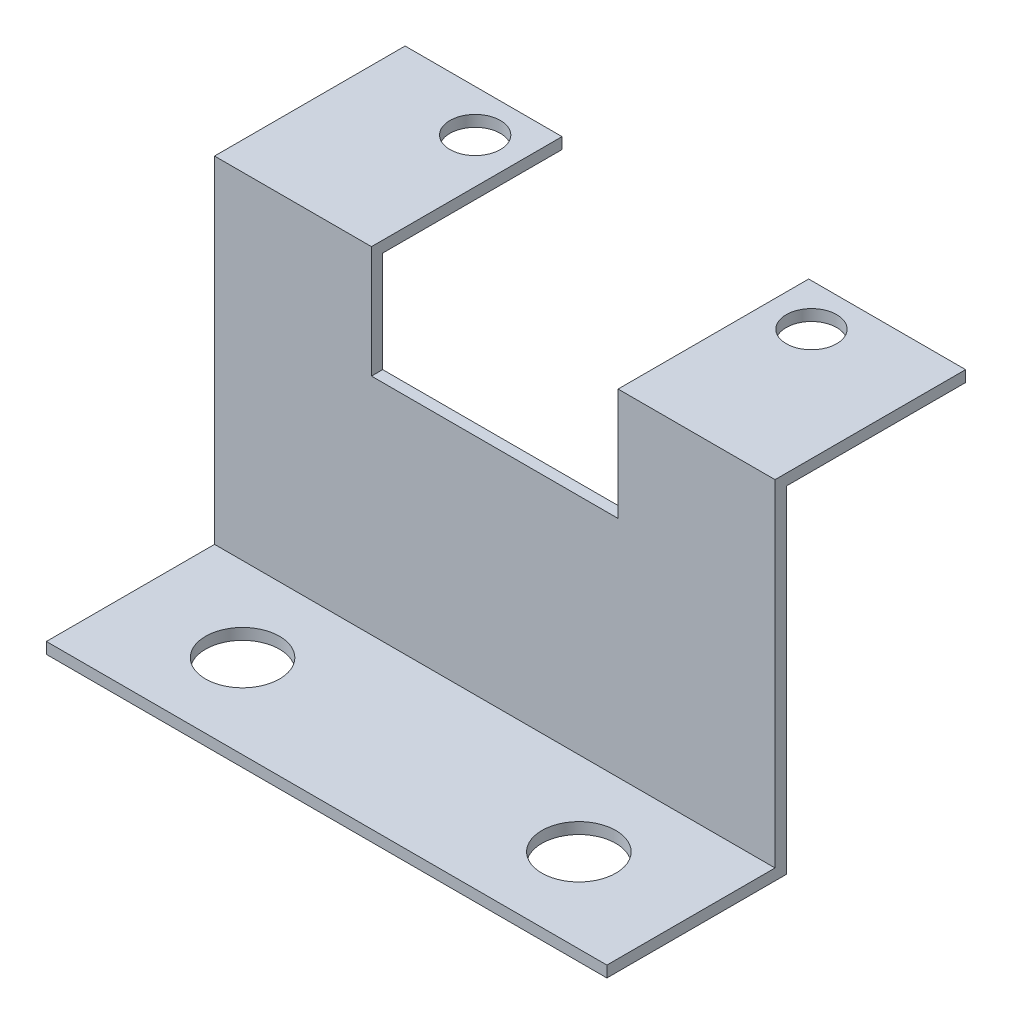
ISO-10303-21;
HEADER;
FILE_DESCRIPTION(('STEP AP214'),'2;1');
FILE_NAME('part.step','',(''),(''),'','','');
FILE_SCHEMA(('AUTOMOTIVE_DESIGN { 1 0 10303 214 1 1 1 1 }'));
ENDSEC;
DATA;
#1=APPLICATION_CONTEXT('core data for automotive mechanical design processes');
#2=APPLICATION_PROTOCOL_DEFINITION('international standard','automotive_design',2000,#1);
#3=PRODUCT_CONTEXT('',#1,'mechanical');
#4=PRODUCT('Part','Part','',(#3));
#5=PRODUCT_RELATED_PRODUCT_CATEGORY('part','',(#4));
#6=PRODUCT_DEFINITION_FORMATION('','',#4);
#7=PRODUCT_DEFINITION_CONTEXT('part definition',#1,'design');
#8=PRODUCT_DEFINITION('design','',#6,#7);
#9=PRODUCT_DEFINITION_SHAPE('','',#8);
#10=(LENGTH_UNIT() NAMED_UNIT(*) SI_UNIT(.MILLI.,.METRE.));
#11=(NAMED_UNIT(*) PLANE_ANGLE_UNIT() SI_UNIT($,.RADIAN.));
#12=(NAMED_UNIT(*) SI_UNIT($,.STERADIAN.) SOLID_ANGLE_UNIT());
#13=UNCERTAINTY_MEASURE_WITH_UNIT(LENGTH_MEASURE(1.E-05),#10,'distance_accuracy_value','');
#14=(GEOMETRIC_REPRESENTATION_CONTEXT(3) GLOBAL_UNCERTAINTY_ASSIGNED_CONTEXT((#13)) GLOBAL_UNIT_ASSIGNED_CONTEXT((#10,
#11,#12)) REPRESENTATION_CONTEXT('',''));
#15=CARTESIAN_POINT('',(0.,0.,0.));
#16=DIRECTION('',(0.,0.,1.));
#17=DIRECTION('',(1.,0.,0.));
#18=AXIS2_PLACEMENT_3D('',#15,#16,#17);
#19=CARTESIAN_POINT('',(25.,30.,-16.));
#20=DIRECTION('',(0.,1.,0.));
#21=DIRECTION('',(0.,0.,1.));
#22=AXIS2_PLACEMENT_3D('',#19,#20,#21);
#23=PLANE('',#22);
#24=CARTESIAN_POINT('',(-15.,30.,-28.25));
#25=DIRECTION('',(0.,1.,0.));
#26=DIRECTION('',(0.,0.,1.));
#27=AXIS2_PLACEMENT_3D('',#24,#25,#26);
#28=CIRCLE('',#27,2.24999999999999);
#29=CARTESIAN_POINT('',(-15.,30.,-26.));
#30=VERTEX_POINT('',#29);
#31=EDGE_CURVE('E324',#30,#30,#28,.T.);
#32=ORIENTED_EDGE('',*,*,#31,.T.);
#33=EDGE_LOOP('',(#32));
#34=FACE_BOUND('',#33,.T.);
#35=DIRECTION('',(-1.,0.,0.));
#36=VECTOR('',#35,1.);
#37=CARTESIAN_POINT('',(25.,30.,-32.));
#38=LINE('',#37,#36);
#39=CARTESIAN_POINT('',(-11.,30.,-32.));
#40=VERTEX_POINT('',#39);
#41=CARTESIAN_POINT('',(-25.,30.,-32.));
#42=VERTEX_POINT('',#41);
#43=EDGE_CURVE('E177',#40,#42,#38,.T.);
#44=ORIENTED_EDGE('',*,*,#43,.F.);
#45=DIRECTION('',(0.,0.,1.));
#46=VECTOR('',#45,1.);
#47=CARTESIAN_POINT('',(-11.,30.,-16.));
#48=LINE('',#47,#46);
#49=CARTESIAN_POINT('',(-11.,30.,-16.));
#50=VERTEX_POINT('',#49);
#51=EDGE_CURVE('E203',#40,#50,#48,.T.);
#52=ORIENTED_EDGE('',*,*,#51,.T.);
#53=DIRECTION('',(-1.,0.,0.));
#54=VECTOR('',#53,1.);
#55=CARTESIAN_POINT('',(25.,30.,-16.));
#56=LINE('',#55,#54);
#57=CARTESIAN_POINT('',(-25.,30.,-16.));
#58=VERTEX_POINT('',#57);
#59=EDGE_CURVE('E181',#50,#58,#56,.T.);
#60=ORIENTED_EDGE('',*,*,#59,.T.);
#61=DIRECTION('',(0.,0.,-1.));
#62=VECTOR('',#61,1.);
#63=CARTESIAN_POINT('',(-25.,30.,-16.));
#64=LINE('',#63,#62);
#65=EDGE_CURVE('E160',#58,#42,#64,.T.);
#66=ORIENTED_EDGE('',*,*,#65,.T.);
#67=EDGE_LOOP('',(#44,#52,#60,#66));
#68=FACE_BOUND('',#67,.T.);
#69=ADVANCED_FACE('F39',(#34,#68),#23,.F.);
#70=CARTESIAN_POINT('',(25.,30.,-32.));
#71=DIRECTION('',(0.,0.,1.));
#72=DIRECTION('',(1.,0.,0.));
#73=AXIS2_PLACEMENT_3D('',#70,#71,#72);
#74=PLANE('',#73);
#75=DIRECTION('',(-1.,0.,0.));
#76=VECTOR('',#75,1.);
#77=CARTESIAN_POINT('',(25.,31.,-32.));
#78=LINE('',#77,#76);
#79=CARTESIAN_POINT('',(-11.,31.,-32.));
#80=VERTEX_POINT('',#79);
#81=CARTESIAN_POINT('',(-25.,31.,-32.));
#82=VERTEX_POINT('',#81);
#83=EDGE_CURVE('E140',#80,#82,#78,.T.);
#84=ORIENTED_EDGE('',*,*,#83,.F.);
#85=DIRECTION('',(0.,1.,0.));
#86=VECTOR('',#85,1.);
#87=CARTESIAN_POINT('',(-11.,21.,-32.));
#88=LINE('',#87,#86);
#89=EDGE_CURVE('E249',#40,#80,#88,.T.);
#90=ORIENTED_EDGE('',*,*,#89,.F.);
#91=ORIENTED_EDGE('',*,*,#43,.T.);
#92=DIRECTION('',(0.,1.,0.));
#93=VECTOR('',#92,1.);
#94=CARTESIAN_POINT('',(-25.,30.,-32.));
#95=LINE('',#94,#93);
#96=EDGE_CURVE('E163',#42,#82,#95,.T.);
#97=ORIENTED_EDGE('',*,*,#96,.T.);
#98=EDGE_LOOP('',(#84,#90,#91,#97));
#99=FACE_BOUND('',#98,.T.);
#100=ADVANCED_FACE('F284',(#99),#74,.F.);
#101=CARTESIAN_POINT('',(25.,31.,-15.));
#102=DIRECTION('',(0.,-1.,0.));
#103=DIRECTION('',(0.,0.,-1.));
#104=AXIS2_PLACEMENT_3D('',#101,#102,#103);
#105=PLANE('',#104);
#106=CARTESIAN_POINT('',(-15.,31.,-28.25));
#107=DIRECTION('',(0.,1.,0.));
#108=DIRECTION('',(0.,0.,1.));
#109=AXIS2_PLACEMENT_3D('',#106,#107,#108);
#110=CIRCLE('',#109,2.24999999999999);
#111=CARTESIAN_POINT('',(-15.,31.,-26.));
#112=VERTEX_POINT('',#111);
#113=EDGE_CURVE('E328',#112,#112,#110,.T.);
#114=ORIENTED_EDGE('',*,*,#113,.F.);
#115=EDGE_LOOP('',(#114));
#116=FACE_BOUND('',#115,.T.);
#117=DIRECTION('',(-1.,0.,0.));
#118=VECTOR('',#117,1.);
#119=CARTESIAN_POINT('',(25.,31.,-15.));
#120=LINE('',#119,#118);
#121=CARTESIAN_POINT('',(-11.,31.,-15.));
#122=VERTEX_POINT('',#121);
#123=CARTESIAN_POINT('',(-25.,31.,-15.));
#124=VERTEX_POINT('',#123);
#125=EDGE_CURVE('E141',#122,#124,#120,.T.);
#126=ORIENTED_EDGE('',*,*,#125,.F.);
#127=DIRECTION('',(0.,0.,1.));
#128=VECTOR('',#127,1.);
#129=CARTESIAN_POINT('',(-11.,31.,-15.));
#130=LINE('',#129,#128);
#131=EDGE_CURVE('E272',#80,#122,#130,.T.);
#132=ORIENTED_EDGE('',*,*,#131,.F.);
#133=ORIENTED_EDGE('',*,*,#83,.T.);
#134=DIRECTION('',(0.,0.,1.));
#135=VECTOR('',#134,1.);
#136=CARTESIAN_POINT('',(-25.,31.,-15.));
#137=LINE('',#136,#135);
#138=EDGE_CURVE('E166',#82,#124,#137,.T.);
#139=ORIENTED_EDGE('',*,*,#138,.T.);
#140=EDGE_LOOP('',(#126,#132,#133,#139));
#141=FACE_BOUND('',#140,.T.);
#142=ADVANCED_FACE('F283',(#116,#141),#105,.F.);
#143=CARTESIAN_POINT('',(25.,0.,0.));
#144=DIRECTION('',(0.,0.,-1.));
#145=DIRECTION('',(-1.,0.,0.));
#146=AXIS2_PLACEMENT_3D('',#143,#144,#145);
#147=PLANE('',#146);
#148=DIRECTION('',(0.,-1.,0.));
#149=VECTOR('',#148,1.);
#150=CARTESIAN_POINT('',(-25.,0.,0.));
#151=LINE('',#150,#149);
#152=CARTESIAN_POINT('',(-25.,1.,0.));
#153=VERTEX_POINT('',#152);
#154=CARTESIAN_POINT('',(-25.,0.,0.));
#155=VERTEX_POINT('',#154);
#156=EDGE_CURVE('E151',#153,#155,#151,.T.);
#157=ORIENTED_EDGE('',*,*,#156,.T.);
#158=DIRECTION('',(-1.,0.,0.));
#159=VECTOR('',#158,1.);
#160=CARTESIAN_POINT('',(25.,0.,0.));
#161=LINE('',#160,#159);
#162=CARTESIAN_POINT('',(25.,0.,0.));
#163=VERTEX_POINT('',#162);
#164=EDGE_CURVE('E11',#163,#155,#161,.T.);
#165=ORIENTED_EDGE('',*,*,#164,.F.);
#166=DIRECTION('',(0.,-1.,0.));
#167=VECTOR('',#166,1.);
#168=CARTESIAN_POINT('',(25.,0.,0.));
#169=LINE('',#168,#167);
#170=CARTESIAN_POINT('',(25.,1.,0.));
#171=VERTEX_POINT('',#170);
#172=EDGE_CURVE('E172',#171,#163,#169,.T.);
#173=ORIENTED_EDGE('',*,*,#172,.F.);
#174=DIRECTION('',(-1.,0.,0.));
#175=VECTOR('',#174,1.);
#176=CARTESIAN_POINT('',(25.,1.,0.));
#177=LINE('',#176,#175);
#178=EDGE_CURVE('E147',#171,#153,#177,.T.);
#179=ORIENTED_EDGE('',*,*,#178,.T.);
#180=EDGE_LOOP('',(#157,#165,#173,#179));
#181=FACE_BOUND('',#180,.T.);
#182=ADVANCED_FACE('F41',(#181),#147,.F.);
#183=CARTESIAN_POINT('',(25.,0.,0.));
#184=DIRECTION('',(0.,1.,0.));
#185=DIRECTION('',(0.,0.,1.));
#186=AXIS2_PLACEMENT_3D('',#183,#184,#185);
#187=PLANE('',#186);
#188=CARTESIAN_POINT('',(-15.,0.,-7.5));
#189=DIRECTION('',(0.,1.,0.));
#190=DIRECTION('',(0.,0.,1.));
#191=AXIS2_PLACEMENT_3D('',#188,#189,#190);
#192=CIRCLE('',#191,3.3);
#193=CARTESIAN_POINT('',(-15.,0.,-4.2));
#194=VERTEX_POINT('',#193);
#195=EDGE_CURVE('E337',#194,#194,#192,.T.);
#196=ORIENTED_EDGE('',*,*,#195,.T.);
#197=EDGE_LOOP('',(#196));
#198=FACE_BOUND('',#197,.T.);
#199=CARTESIAN_POINT('',(15.,0.,-7.5));
#200=DIRECTION('',(0.,1.,0.));
#201=DIRECTION('',(0.,0.,1.));
#202=AXIS2_PLACEMENT_3D('',#199,#200,#201);
#203=CIRCLE('',#202,3.3);
#204=CARTESIAN_POINT('',(15.,0.,-4.2));
#205=VERTEX_POINT('',#204);
#206=EDGE_CURVE('E331',#205,#205,#203,.T.);
#207=ORIENTED_EDGE('',*,*,#206,.T.);
#208=EDGE_LOOP('',(#207));
#209=FACE_BOUND('',#208,.T.);
#210=DIRECTION('',(0.,0.,-1.));
#211=VECTOR('',#210,1.);
#212=CARTESIAN_POINT('',(-25.,0.,0.));
#213=LINE('',#212,#211);
#214=CARTESIAN_POINT('',(-25.,0.,-16.));
#215=VERTEX_POINT('',#214);
#216=EDGE_CURVE('E154',#155,#215,#213,.T.);
#217=ORIENTED_EDGE('',*,*,#216,.T.);
#218=DIRECTION('',(-1.,0.,0.));
#219=VECTOR('',#218,1.);
#220=CARTESIAN_POINT('',(25.,0.,-16.));
#221=LINE('',#220,#219);
#222=CARTESIAN_POINT('',(25.,0.,-16.));
#223=VERTEX_POINT('',#222);
#224=EDGE_CURVE('E47',#223,#215,#221,.T.);
#225=ORIENTED_EDGE('',*,*,#224,.F.);
#226=DIRECTION('',(0.,0.,-1.));
#227=VECTOR('',#226,1.);
#228=CARTESIAN_POINT('',(25.,0.,0.));
#229=LINE('',#228,#227);
#230=EDGE_CURVE('E104',#163,#223,#229,.T.);
#231=ORIENTED_EDGE('',*,*,#230,.F.);
#232=ORIENTED_EDGE('',*,*,#164,.T.);
#233=EDGE_LOOP('',(#217,#225,#231,#232));
#234=FACE_BOUND('',#233,.T.);
#235=ADVANCED_FACE('F290',(#198,#209,#234),#187,.F.);
#236=CARTESIAN_POINT('',(25.,0.,-16.));
#237=DIRECTION('',(0.,0.,1.));
#238=DIRECTION('',(1.,0.,0.));
#239=AXIS2_PLACEMENT_3D('',#236,#237,#238);
#240=PLANE('',#239);
#241=ORIENTED_EDGE('',*,*,#59,.F.);
#242=DIRECTION('',(0.,-1.,0.));
#243=VECTOR('',#242,1.);
#244=CARTESIAN_POINT('',(-11.,0.,-16.));
#245=LINE('',#244,#243);
#246=CARTESIAN_POINT('',(-11.,21.,-16.));
#247=VERTEX_POINT('',#246);
#248=EDGE_CURVE('E155',#50,#247,#245,.T.);
#249=ORIENTED_EDGE('',*,*,#248,.T.);
#250=DIRECTION('',(1.,0.,0.));
#251=VECTOR('',#250,1.);
#252=CARTESIAN_POINT('',(25.,21.,-16.));
#253=LINE('',#252,#251);
#254=CARTESIAN_POINT('',(11.,21.,-16.));
#255=VERTEX_POINT('',#254);
#256=EDGE_CURVE('E254',#247,#255,#253,.T.);
#257=ORIENTED_EDGE('',*,*,#256,.T.);
#258=DIRECTION('',(0.,1.,0.));
#259=VECTOR('',#258,1.);
#260=CARTESIAN_POINT('',(11.,0.,-16.));
#261=LINE('',#260,#259);
#262=CARTESIAN_POINT('',(11.,30.,-16.));
#263=VERTEX_POINT('',#262);
#264=EDGE_CURVE('E239',#255,#263,#261,.T.);
#265=ORIENTED_EDGE('',*,*,#264,.T.);
#266=CARTESIAN_POINT('',(25.,30.,-16.));
#267=VERTEX_POINT('',#266);
#268=EDGE_CURVE('E182',#267,#263,#56,.T.);
#269=ORIENTED_EDGE('',*,*,#268,.F.);
#270=DIRECTION('',(0.,1.,0.));
#271=VECTOR('',#270,1.);
#272=CARTESIAN_POINT('',(25.,0.,-16.));
#273=LINE('',#272,#271);
#274=EDGE_CURVE('E192',#223,#267,#273,.T.);
#275=ORIENTED_EDGE('',*,*,#274,.F.);
#276=ORIENTED_EDGE('',*,*,#224,.T.);
#277=DIRECTION('',(0.,1.,0.));
#278=VECTOR('',#277,1.);
#279=CARTESIAN_POINT('',(-25.,0.,-16.));
#280=LINE('',#279,#278);
#281=EDGE_CURVE('E157',#215,#58,#280,.T.);
#282=ORIENTED_EDGE('',*,*,#281,.T.);
#283=EDGE_LOOP('',(#241,#249,#257,#265,#269,#275,#276,#282));
#284=FACE_BOUND('',#283,.T.);
#285=ADVANCED_FACE('F189',(#284),#240,.F.);
#286=CARTESIAN_POINT('',(15.,30.,-28.25));
#287=DIRECTION('',(0.,1.,0.));
#288=DIRECTION('',(0.,0.,1.));
#289=AXIS2_PLACEMENT_3D('',#286,#287,#288);
#290=CIRCLE('',#289,2.24999999999999);
#291=CARTESIAN_POINT('',(15.,30.,-26.));
#292=VERTEX_POINT('',#291);
#293=EDGE_CURVE('E275',#292,#292,#290,.T.);
#294=ORIENTED_EDGE('',*,*,#293,.T.);
#295=EDGE_LOOP('',(#294));
#296=FACE_BOUND('',#295,.T.);
#297=ORIENTED_EDGE('',*,*,#268,.T.);
#298=DIRECTION('',(0.,0.,-1.));
#299=VECTOR('',#298,1.);
#300=CARTESIAN_POINT('',(11.,30.,-16.));
#301=LINE('',#300,#299);
#302=CARTESIAN_POINT('',(11.,30.,-32.));
#303=VERTEX_POINT('',#302);
#304=EDGE_CURVE('E256',#263,#303,#301,.T.);
#305=ORIENTED_EDGE('',*,*,#304,.T.);
#306=CARTESIAN_POINT('',(25.,30.,-32.));
#307=VERTEX_POINT('',#306);
#308=EDGE_CURVE('E178',#307,#303,#38,.T.);
#309=ORIENTED_EDGE('',*,*,#308,.F.);
#310=DIRECTION('',(0.,0.,-1.));
#311=VECTOR('',#310,1.);
#312=CARTESIAN_POINT('',(25.,30.,-16.));
#313=LINE('',#312,#311);
#314=EDGE_CURVE('E265',#267,#307,#313,.T.);
#315=ORIENTED_EDGE('',*,*,#314,.F.);
#316=EDGE_LOOP('',(#297,#305,#309,#315));
#317=FACE_BOUND('',#316,.T.);
#318=ADVANCED_FACE('F269',(#296,#317),#23,.F.);
#319=ORIENTED_EDGE('',*,*,#308,.T.);
#320=DIRECTION('',(0.,1.,0.));
#321=VECTOR('',#320,1.);
#322=CARTESIAN_POINT('',(11.,21.,-32.));
#323=LINE('',#322,#321);
#324=CARTESIAN_POINT('',(11.,31.,-32.));
#325=VERTEX_POINT('',#324);
#326=EDGE_CURVE('E246',#303,#325,#323,.T.);
#327=ORIENTED_EDGE('',*,*,#326,.T.);
#328=CARTESIAN_POINT('',(25.,31.,-32.));
#329=VERTEX_POINT('',#328);
#330=EDGE_CURVE('E175',#329,#325,#78,.T.);
#331=ORIENTED_EDGE('',*,*,#330,.F.);
#332=DIRECTION('',(0.,1.,0.));
#333=VECTOR('',#332,1.);
#334=CARTESIAN_POINT('',(25.,30.,-32.));
#335=LINE('',#334,#333);
#336=EDGE_CURVE('E126',#307,#329,#335,.T.);
#337=ORIENTED_EDGE('',*,*,#336,.F.);
#338=EDGE_LOOP('',(#319,#327,#331,#337));
#339=FACE_BOUND('',#338,.T.);
#340=ADVANCED_FACE('F271',(#339),#74,.F.);
#341=CARTESIAN_POINT('',(15.,31.,-28.25));
#342=DIRECTION('',(0.,1.,0.));
#343=DIRECTION('',(0.,0.,1.));
#344=AXIS2_PLACEMENT_3D('',#341,#342,#343);
#345=CIRCLE('',#344,2.24999999999999);
#346=CARTESIAN_POINT('',(15.,31.,-26.));
#347=VERTEX_POINT('',#346);
#348=EDGE_CURVE('E321',#347,#347,#345,.T.);
#349=ORIENTED_EDGE('',*,*,#348,.F.);
#350=EDGE_LOOP('',(#349));
#351=FACE_BOUND('',#350,.T.);
#352=ORIENTED_EDGE('',*,*,#330,.T.);
#353=DIRECTION('',(0.,0.,-1.));
#354=VECTOR('',#353,1.);
#355=CARTESIAN_POINT('',(11.,31.,-15.));
#356=LINE('',#355,#354);
#357=CARTESIAN_POINT('',(11.,31.,-15.));
#358=VERTEX_POINT('',#357);
#359=EDGE_CURVE('E137',#358,#325,#356,.T.);
#360=ORIENTED_EDGE('',*,*,#359,.F.);
#361=CARTESIAN_POINT('',(25.,31.,-15.));
#362=VERTEX_POINT('',#361);
#363=EDGE_CURVE('E133',#362,#358,#120,.T.);
#364=ORIENTED_EDGE('',*,*,#363,.F.);
#365=DIRECTION('',(0.,0.,1.));
#366=VECTOR('',#365,1.);
#367=CARTESIAN_POINT('',(25.,31.,-15.));
#368=LINE('',#367,#366);
#369=EDGE_CURVE('E119',#329,#362,#368,.T.);
#370=ORIENTED_EDGE('',*,*,#369,.F.);
#371=EDGE_LOOP('',(#352,#360,#364,#370));
#372=FACE_BOUND('',#371,.T.);
#373=ADVANCED_FACE('F134',(#351,#372),#105,.F.);
#374=CARTESIAN_POINT('',(25.,1.,-15.));
#375=DIRECTION('',(0.,0.,-1.));
#376=DIRECTION('',(-1.,0.,0.));
#377=AXIS2_PLACEMENT_3D('',#374,#375,#376);
#378=PLANE('',#377);
#379=DIRECTION('',(1.,0.,0.));
#380=VECTOR('',#379,1.);
#381=CARTESIAN_POINT('',(-11.,21.,-15.));
#382=LINE('',#381,#380);
#383=CARTESIAN_POINT('',(-11.,21.,-15.));
#384=VERTEX_POINT('',#383);
#385=CARTESIAN_POINT('',(11.,21.,-15.));
#386=VERTEX_POINT('',#385);
#387=EDGE_CURVE('E241',#384,#386,#382,.T.);
#388=ORIENTED_EDGE('',*,*,#387,.F.);
#389=DIRECTION('',(0.,1.,0.));
#390=VECTOR('',#389,1.);
#391=CARTESIAN_POINT('',(-11.,21.,-15.));
#392=LINE('',#391,#390);
#393=EDGE_CURVE('E54',#384,#122,#392,.T.);
#394=ORIENTED_EDGE('',*,*,#393,.T.);
#395=ORIENTED_EDGE('',*,*,#125,.T.);
#396=DIRECTION('',(0.,-1.,0.));
#397=VECTOR('',#396,1.);
#398=CARTESIAN_POINT('',(-25.,1.,-15.));
#399=LINE('',#398,#397);
#400=CARTESIAN_POINT('',(-25.,1.,-15.));
#401=VERTEX_POINT('',#400);
#402=EDGE_CURVE('E169',#124,#401,#399,.T.);
#403=ORIENTED_EDGE('',*,*,#402,.T.);
#404=DIRECTION('',(-1.,0.,0.));
#405=VECTOR('',#404,1.);
#406=CARTESIAN_POINT('',(25.,1.,-15.));
#407=LINE('',#406,#405);
#408=CARTESIAN_POINT('',(25.,1.,-15.));
#409=VERTEX_POINT('',#408);
#410=EDGE_CURVE('E145',#409,#401,#407,.T.);
#411=ORIENTED_EDGE('',*,*,#410,.F.);
#412=DIRECTION('',(0.,-1.,0.));
#413=VECTOR('',#412,1.);
#414=CARTESIAN_POINT('',(25.,1.,-15.));
#415=LINE('',#414,#413);
#416=EDGE_CURVE('E123',#362,#409,#415,.T.);
#417=ORIENTED_EDGE('',*,*,#416,.F.);
#418=ORIENTED_EDGE('',*,*,#363,.T.);
#419=DIRECTION('',(0.,1.,0.));
#420=VECTOR('',#419,1.);
#421=CARTESIAN_POINT('',(11.,21.,-15.));
#422=LINE('',#421,#420);
#423=EDGE_CURVE('E237',#386,#358,#422,.T.);
#424=ORIENTED_EDGE('',*,*,#423,.F.);
#425=EDGE_LOOP('',(#388,#394,#395,#403,#411,#417,#418,#424));
#426=FACE_BOUND('',#425,.T.);
#427=ADVANCED_FACE('F144',(#426),#378,.F.);
#428=CARTESIAN_POINT('',(25.,1.,0.));
#429=DIRECTION('',(0.,-1.,0.));
#430=DIRECTION('',(0.,0.,-1.));
#431=AXIS2_PLACEMENT_3D('',#428,#429,#430);
#432=PLANE('',#431);
#433=CARTESIAN_POINT('',(-15.,1.,-7.5));
#434=DIRECTION('',(0.,1.,0.));
#435=DIRECTION('',(0.,0.,1.));
#436=AXIS2_PLACEMENT_3D('',#433,#434,#435);
#437=CIRCLE('',#436,3.3);
#438=CARTESIAN_POINT('',(-15.,1.,-4.2));
#439=VERTEX_POINT('',#438);
#440=EDGE_CURVE('E339',#439,#439,#437,.T.);
#441=ORIENTED_EDGE('',*,*,#440,.F.);
#442=EDGE_LOOP('',(#441));
#443=FACE_BOUND('',#442,.T.);
#444=CARTESIAN_POINT('',(15.,1.,-7.5));
#445=DIRECTION('',(0.,1.,0.));
#446=DIRECTION('',(0.,0.,1.));
#447=AXIS2_PLACEMENT_3D('',#444,#445,#446);
#448=CIRCLE('',#447,3.3);
#449=CARTESIAN_POINT('',(15.,1.,-4.2));
#450=VERTEX_POINT('',#449);
#451=EDGE_CURVE('E334',#450,#450,#448,.T.);
#452=ORIENTED_EDGE('',*,*,#451,.F.);
#453=EDGE_LOOP('',(#452));
#454=FACE_BOUND('',#453,.T.);
#455=DIRECTION('',(0.,0.,1.));
#456=VECTOR('',#455,1.);
#457=CARTESIAN_POINT('',(-25.,1.,0.));
#458=LINE('',#457,#456);
#459=EDGE_CURVE('E96',#401,#153,#458,.T.);
#460=ORIENTED_EDGE('',*,*,#459,.T.);
#461=ORIENTED_EDGE('',*,*,#178,.F.);
#462=DIRECTION('',(0.,0.,1.));
#463=VECTOR('',#462,1.);
#464=CARTESIAN_POINT('',(25.,1.,0.));
#465=LINE('',#464,#463);
#466=EDGE_CURVE('E63',#409,#171,#465,.T.);
#467=ORIENTED_EDGE('',*,*,#466,.F.);
#468=ORIENTED_EDGE('',*,*,#410,.T.);
#469=EDGE_LOOP('',(#460,#461,#467,#468));
#470=FACE_BOUND('',#469,.T.);
#471=ADVANCED_FACE('F286',(#443,#454,#470),#432,.F.);
#472=CARTESIAN_POINT('',(25.,0.,0.));
#473=DIRECTION('',(-1.,0.,0.));
#474=DIRECTION('',(0.,0.,1.));
#475=AXIS2_PLACEMENT_3D('',#472,#473,#474);
#476=PLANE('',#475);
#477=ORIENTED_EDGE('',*,*,#172,.T.);
#478=ORIENTED_EDGE('',*,*,#230,.T.);
#479=ORIENTED_EDGE('',*,*,#274,.T.);
#480=ORIENTED_EDGE('',*,*,#314,.T.);
#481=ORIENTED_EDGE('',*,*,#336,.T.);
#482=ORIENTED_EDGE('',*,*,#369,.T.);
#483=ORIENTED_EDGE('',*,*,#416,.T.);
#484=ORIENTED_EDGE('',*,*,#466,.T.);
#485=EDGE_LOOP('',(#477,#478,#479,#480,#481,#482,#483,#484));
#486=FACE_BOUND('',#485,.T.);
#487=ADVANCED_FACE('F121',(#486),#476,.F.);
#488=CARTESIAN_POINT('',(-25.,0.,0.));
#489=DIRECTION('',(-1.,0.,0.));
#490=DIRECTION('',(0.,0.,1.));
#491=AXIS2_PLACEMENT_3D('',#488,#489,#490);
#492=PLANE('',#491);
#493=ORIENTED_EDGE('',*,*,#156,.F.);
#494=ORIENTED_EDGE('',*,*,#459,.F.);
#495=ORIENTED_EDGE('',*,*,#402,.F.);
#496=ORIENTED_EDGE('',*,*,#138,.F.);
#497=ORIENTED_EDGE('',*,*,#96,.F.);
#498=ORIENTED_EDGE('',*,*,#65,.F.);
#499=ORIENTED_EDGE('',*,*,#281,.F.);
#500=ORIENTED_EDGE('',*,*,#216,.F.);
#501=EDGE_LOOP('',(#493,#494,#495,#496,#497,#498,#499,#500));
#502=FACE_BOUND('',#501,.T.);
#503=ADVANCED_FACE('F195',(#502),#492,.T.);
#504=CARTESIAN_POINT('',(-11.,21.,-15.));
#505=DIRECTION('',(-1.,0.,0.));
#506=DIRECTION('',(0.,0.,1.));
#507=AXIS2_PLACEMENT_3D('',#504,#505,#506);
#508=PLANE('',#507);
#509=ORIENTED_EDGE('',*,*,#51,.F.);
#510=ORIENTED_EDGE('',*,*,#89,.T.);
#511=ORIENTED_EDGE('',*,*,#131,.T.);
#512=ORIENTED_EDGE('',*,*,#393,.F.);
#513=DIRECTION('',(0.,0.,1.));
#514=VECTOR('',#513,1.);
#515=CARTESIAN_POINT('',(-11.,21.,-15.));
#516=LINE('',#515,#514);
#517=EDGE_CURVE('E244',#247,#384,#516,.T.);
#518=ORIENTED_EDGE('',*,*,#517,.F.);
#519=ORIENTED_EDGE('',*,*,#248,.F.);
#520=EDGE_LOOP('',(#509,#510,#511,#512,#518,#519));
#521=FACE_BOUND('',#520,.T.);
#522=ADVANCED_FACE('F278',(#521),#508,.F.);
#523=CARTESIAN_POINT('',(11.,21.,-15.));
#524=DIRECTION('',(1.,0.,0.));
#525=DIRECTION('',(0.,0.,-1.));
#526=AXIS2_PLACEMENT_3D('',#523,#524,#525);
#527=PLANE('',#526);
#528=DIRECTION('',(0.,0.,-1.));
#529=VECTOR('',#528,1.);
#530=CARTESIAN_POINT('',(11.,21.,-15.));
#531=LINE('',#530,#529);
#532=EDGE_CURVE('E234',#386,#255,#531,.T.);
#533=ORIENTED_EDGE('',*,*,#532,.F.);
#534=ORIENTED_EDGE('',*,*,#423,.T.);
#535=ORIENTED_EDGE('',*,*,#359,.T.);
#536=ORIENTED_EDGE('',*,*,#326,.F.);
#537=ORIENTED_EDGE('',*,*,#304,.F.);
#538=ORIENTED_EDGE('',*,*,#264,.F.);
#539=EDGE_LOOP('',(#533,#534,#535,#536,#537,#538));
#540=FACE_BOUND('',#539,.T.);
#541=ADVANCED_FACE('F236',(#540),#527,.F.);
#542=CARTESIAN_POINT('',(0.,21.,0.));
#543=DIRECTION('',(0.,-1.,0.));
#544=DIRECTION('',(0.,0.,-1.));
#545=AXIS2_PLACEMENT_3D('',#542,#543,#544);
#546=PLANE('',#545);
#547=ORIENTED_EDGE('',*,*,#517,.T.);
#548=ORIENTED_EDGE('',*,*,#387,.T.);
#549=ORIENTED_EDGE('',*,*,#532,.T.);
#550=ORIENTED_EDGE('',*,*,#256,.F.);
#551=EDGE_LOOP('',(#547,#548,#549,#550));
#552=FACE_BOUND('',#551,.T.);
#553=ADVANCED_FACE('F243',(#552),#546,.F.);
#554=CARTESIAN_POINT('',(15.,31.,-28.25));
#555=DIRECTION('',(0.,1.,0.));
#556=DIRECTION('',(0.,0.,1.));
#557=AXIS2_PLACEMENT_3D('',#554,#555,#556);
#558=CYLINDRICAL_SURFACE('',#557,2.24999999999999);
#559=ORIENTED_EDGE('',*,*,#348,.T.);
#560=EDGE_LOOP('',(#559));
#561=FACE_BOUND('',#560,.T.);
#562=ORIENTED_EDGE('',*,*,#293,.F.);
#563=EDGE_LOOP('',(#562));
#564=FACE_BOUND('',#563,.T.);
#565=ADVANCED_FACE('F359',(#561,#564),#558,.F.);
#566=CARTESIAN_POINT('',(-15.,31.,-28.25));
#567=DIRECTION('',(0.,1.,0.));
#568=DIRECTION('',(0.,0.,1.));
#569=AXIS2_PLACEMENT_3D('',#566,#567,#568);
#570=CYLINDRICAL_SURFACE('',#569,2.24999999999999);
#571=ORIENTED_EDGE('',*,*,#113,.T.);
#572=EDGE_LOOP('',(#571));
#573=FACE_BOUND('',#572,.T.);
#574=ORIENTED_EDGE('',*,*,#31,.F.);
#575=EDGE_LOOP('',(#574));
#576=FACE_BOUND('',#575,.T.);
#577=ADVANCED_FACE('F351',(#573,#576),#570,.F.);
#578=CARTESIAN_POINT('',(15.,1.,-7.5));
#579=DIRECTION('',(0.,1.,0.));
#580=DIRECTION('',(0.,0.,1.));
#581=AXIS2_PLACEMENT_3D('',#578,#579,#580);
#582=CYLINDRICAL_SURFACE('',#581,3.3);
#583=ORIENTED_EDGE('',*,*,#206,.F.);
#584=EDGE_LOOP('',(#583));
#585=FACE_BOUND('',#584,.T.);
#586=ORIENTED_EDGE('',*,*,#451,.T.);
#587=EDGE_LOOP('',(#586));
#588=FACE_BOUND('',#587,.T.);
#589=ADVANCED_FACE('F349',(#585,#588),#582,.F.);
#590=CARTESIAN_POINT('',(-15.,1.,-7.5));
#591=DIRECTION('',(0.,1.,0.));
#592=DIRECTION('',(0.,0.,1.));
#593=AXIS2_PLACEMENT_3D('',#590,#591,#592);
#594=CYLINDRICAL_SURFACE('',#593,3.3);
#595=ORIENTED_EDGE('',*,*,#195,.F.);
#596=EDGE_LOOP('',(#595));
#597=FACE_BOUND('',#596,.T.);
#598=ORIENTED_EDGE('',*,*,#440,.T.);
#599=EDGE_LOOP('',(#598));
#600=FACE_BOUND('',#599,.T.);
#601=ADVANCED_FACE('F343',(#597,#600),#594,.F.);
#602=CLOSED_SHELL('',(#69,#100,#142,#182,#235,#285,#318,#340,#373,#427,#471,#487,#503,#522,#541,
#553,#565,#577,#589,#601));
#603=MANIFOLD_SOLID_BREP('B2',#602);
#604=ADVANCED_BREP_SHAPE_REPRESENTATION('',(#18,#603),#14);
#605=SHAPE_DEFINITION_REPRESENTATION(#9,#604);
ENDSEC;
END-ISO-10303-21;
